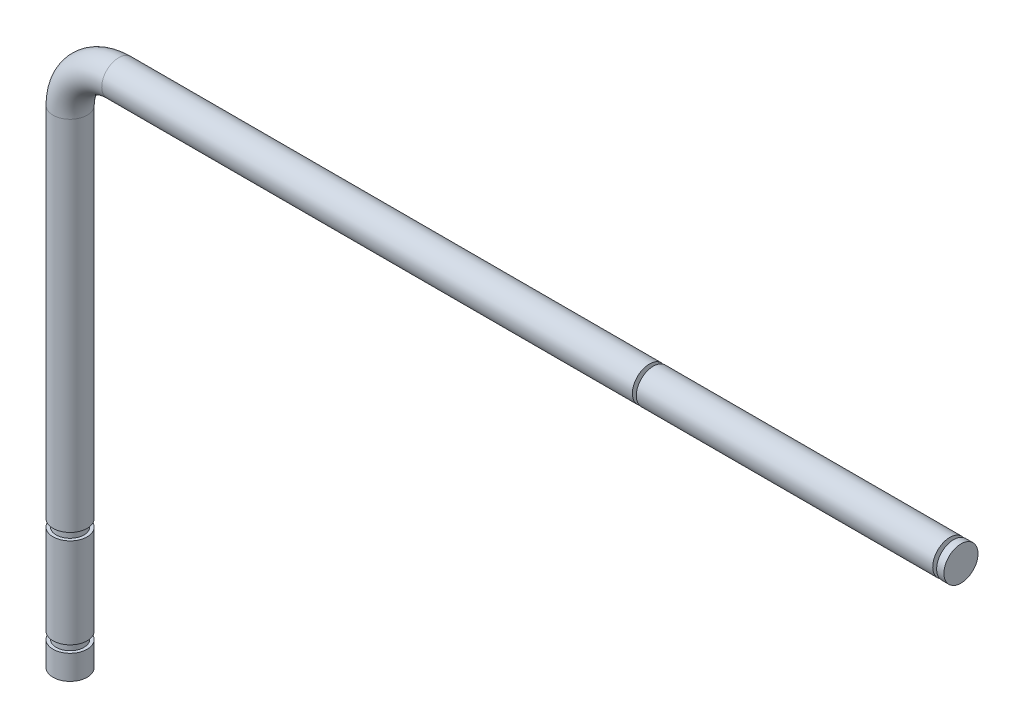
ISO-10303-21;
HEADER;
FILE_DESCRIPTION(('STEP AP214'),'2;1');
FILE_NAME('part.step','',(''),(''),'','','');
FILE_SCHEMA(('AUTOMOTIVE_DESIGN { 1 0 10303 214 1 1 1 1 }'));
ENDSEC;
DATA;
#1=APPLICATION_CONTEXT('core data for automotive mechanical design processes');
#2=APPLICATION_PROTOCOL_DEFINITION('international standard','automotive_design',2000,#1);
#3=PRODUCT_CONTEXT('',#1,'mechanical');
#4=PRODUCT('Part','Part','',(#3));
#5=PRODUCT_RELATED_PRODUCT_CATEGORY('part','',(#4));
#6=PRODUCT_DEFINITION_FORMATION('','',#4);
#7=PRODUCT_DEFINITION_CONTEXT('part definition',#1,'design');
#8=PRODUCT_DEFINITION('design','',#6,#7);
#9=PRODUCT_DEFINITION_SHAPE('','',#8);
#10=(LENGTH_UNIT() NAMED_UNIT(*) SI_UNIT(.MILLI.,.METRE.));
#11=(NAMED_UNIT(*) PLANE_ANGLE_UNIT() SI_UNIT($,.RADIAN.));
#12=(NAMED_UNIT(*) SI_UNIT($,.STERADIAN.) SOLID_ANGLE_UNIT());
#13=UNCERTAINTY_MEASURE_WITH_UNIT(LENGTH_MEASURE(1.E-05),#10,'distance_accuracy_value','');
#14=(GEOMETRIC_REPRESENTATION_CONTEXT(3) GLOBAL_UNCERTAINTY_ASSIGNED_CONTEXT((#13)) GLOBAL_UNIT_ASSIGNED_CONTEXT((#10,
#11,#12)) REPRESENTATION_CONTEXT('',''));
#15=CARTESIAN_POINT('',(0.,0.,0.));
#16=DIRECTION('',(0.,0.,1.));
#17=DIRECTION('',(1.,0.,0.));
#18=AXIS2_PLACEMENT_3D('',#15,#16,#17);
#19=CARTESIAN_POINT('',(183.,0.,0.));
#20=DIRECTION('',(-1.,0.,0.));
#21=DIRECTION('',(0.,0.,1.));
#22=AXIS2_PLACEMENT_3D('',#19,#20,#21);
#23=CYLINDRICAL_SURFACE('',#22,3.5);
#24=CARTESIAN_POINT('',(10.0000000000001,0.,0.));
#25=DIRECTION('',(1.,0.,0.));
#26=DIRECTION('',(0.,1.,0.));
#27=AXIS2_PLACEMENT_3D('',#24,#25,#26);
#28=CIRCLE('',#27,3.5);
#29=CARTESIAN_POINT('',(10.0000000000001,3.5,0.));
#30=VERTEX_POINT('',#29);
#31=EDGE_CURVE('E157',#30,#30,#28,.T.);
#32=ORIENTED_EDGE('',*,*,#31,.T.);
#33=EDGE_LOOP('',(#32));
#34=FACE_BOUND('',#33,.T.);
#35=CARTESIAN_POINT('',(119.,0.,0.));
#36=DIRECTION('',(1.,0.,0.));
#37=DIRECTION('',(0.,1.,0.));
#38=AXIS2_PLACEMENT_3D('',#35,#36,#37);
#39=CIRCLE('',#38,3.5);
#40=CARTESIAN_POINT('',(119.,3.5,0.));
#41=VERTEX_POINT('',#40);
#42=EDGE_CURVE('E127',#41,#41,#39,.T.);
#43=ORIENTED_EDGE('',*,*,#42,.F.);
#44=EDGE_LOOP('',(#43));
#45=FACE_BOUND('',#44,.T.);
#46=ADVANCED_FACE('F47',(#34,#45),#23,.T.);
#47=CARTESIAN_POINT('',(0.,-10.0000000000001,0.));
#48=DIRECTION('',(0.,-1.,0.));
#49=DIRECTION('',(1.,0.,0.));
#50=AXIS2_PLACEMENT_3D('',#47,#48,#49);
#51=CYLINDRICAL_SURFACE('',#50,3.5);
#52=CARTESIAN_POINT('',(0.,-85.,0.));
#53=DIRECTION('',(0.,-1.,0.));
#54=DIRECTION('',(1.,0.,0.));
#55=AXIS2_PLACEMENT_3D('',#52,#53,#54);
#56=CIRCLE('',#55,3.5);
#57=CARTESIAN_POINT('',(3.50000000000001,-85.,0.));
#58=VERTEX_POINT('',#57);
#59=EDGE_CURVE('E146',#58,#58,#56,.T.);
#60=CARTESIAN_POINT('',(0.,-103.5,0.));
#61=DIRECTION('',(0.,-1.,0.));
#62=DIRECTION('',(1.,0.,0.));
#63=AXIS2_PLACEMENT_3D('',#60,#61,#62);
#64=CIRCLE('',#63,3.5);
#65=CARTESIAN_POINT('',(3.50000000000001,-103.5,0.));
#66=VERTEX_POINT('',#65);
#67=EDGE_CURVE('E158',#66,#66,#64,.T.);
#68=CARTESIAN_POINT('',(3.50000000000001,-85.,0.));
#69=CARTESIAN_POINT('',(3.50000000000001,-85.1927083333333,0.));
#70=CARTESIAN_POINT('',(3.50000000000001,-85.3854166666666,0.));
#71=CARTESIAN_POINT('',(3.50000000000001,-85.7708333333333,0.));
#72=CARTESIAN_POINT('',(3.50000000000001,-85.9635416666666,0.));
#73=CARTESIAN_POINT('',(3.50000000000001,-86.3489583333333,0.));
#74=CARTESIAN_POINT('',(3.50000000000001,-86.5416666666666,0.));
#75=CARTESIAN_POINT('',(3.50000000000001,-86.9270833333333,0.));
#76=CARTESIAN_POINT('',(3.50000000000001,-87.1197916666666,0.));
#77=CARTESIAN_POINT('',(3.50000000000001,-87.5052083333333,0.));
#78=CARTESIAN_POINT('',(3.50000000000001,-87.6979166666666,0.));
#79=CARTESIAN_POINT('',(3.50000000000001,-88.0833333333333,0.));
#80=CARTESIAN_POINT('',(3.50000000000001,-88.2760416666666,0.));
#81=CARTESIAN_POINT('',(3.50000000000001,-88.6614583333333,0.));
#82=CARTESIAN_POINT('',(3.50000000000001,-88.8541666666666,0.));
#83=CARTESIAN_POINT('',(3.50000000000001,-89.2395833333333,0.));
#84=CARTESIAN_POINT('',(3.50000000000001,-89.4322916666666,0.));
#85=CARTESIAN_POINT('',(3.50000000000001,-89.8177083333333,0.));
#86=CARTESIAN_POINT('',(3.50000000000001,-90.0104166666666,0.));
#87=CARTESIAN_POINT('',(3.50000000000001,-90.3958333333333,0.));
#88=CARTESIAN_POINT('',(3.50000000000001,-90.5885416666666,0.));
#89=CARTESIAN_POINT('',(3.50000000000001,-90.9739583333333,0.));
#90=CARTESIAN_POINT('',(3.50000000000001,-91.1666666666666,0.));
#91=CARTESIAN_POINT('',(3.50000000000001,-91.5520833333333,0.));
#92=CARTESIAN_POINT('',(3.50000000000001,-91.7447916666666,0.));
#93=CARTESIAN_POINT('',(3.50000000000001,-92.1302083333333,0.));
#94=CARTESIAN_POINT('',(3.50000000000001,-92.3229166666666,0.));
#95=CARTESIAN_POINT('',(3.50000000000001,-92.7083333333333,0.));
#96=CARTESIAN_POINT('',(3.50000000000001,-92.9010416666666,0.));
#97=CARTESIAN_POINT('',(3.50000000000001,-93.2864583333333,0.));
#98=CARTESIAN_POINT('',(3.50000000000001,-93.4791666666666,0.));
#99=CARTESIAN_POINT('',(3.50000000000001,-93.8645833333333,0.));
#100=CARTESIAN_POINT('',(3.50000000000001,-94.0572916666666,0.));
#101=CARTESIAN_POINT('',(3.50000000000001,-94.4427083333333,0.));
#102=CARTESIAN_POINT('',(3.50000000000001,-94.6354166666666,0.));
#103=CARTESIAN_POINT('',(3.50000000000001,-95.0208333333333,0.));
#104=CARTESIAN_POINT('',(3.50000000000001,-95.2135416666666,0.));
#105=CARTESIAN_POINT('',(3.50000000000001,-95.5989583333333,0.));
#106=CARTESIAN_POINT('',(3.50000000000001,-95.7916666666666,0.));
#107=CARTESIAN_POINT('',(3.50000000000001,-96.1770833333333,0.));
#108=CARTESIAN_POINT('',(3.50000000000001,-96.3697916666666,0.));
#109=CARTESIAN_POINT('',(3.50000000000001,-96.7552083333333,0.));
#110=CARTESIAN_POINT('',(3.50000000000001,-96.9479166666666,0.));
#111=CARTESIAN_POINT('',(3.50000000000001,-97.3333333333333,0.));
#112=CARTESIAN_POINT('',(3.50000000000001,-97.5260416666666,0.));
#113=CARTESIAN_POINT('',(3.50000000000001,-97.9114583333333,0.));
#114=CARTESIAN_POINT('',(3.50000000000001,-98.1041666666666,0.));
#115=CARTESIAN_POINT('',(3.50000000000001,-98.4895833333333,0.));
#116=CARTESIAN_POINT('',(3.50000000000001,-98.6822916666666,0.));
#117=CARTESIAN_POINT('',(3.50000000000001,-99.0677083333333,0.));
#118=CARTESIAN_POINT('',(3.50000000000001,-99.2604166666666,0.));
#119=CARTESIAN_POINT('',(3.50000000000001,-99.6458333333333,0.));
#120=CARTESIAN_POINT('',(3.50000000000001,-99.8385416666666,0.));
#121=CARTESIAN_POINT('',(3.50000000000001,-100.223958333333,0.));
#122=CARTESIAN_POINT('',(3.50000000000001,-100.416666666667,0.));
#123=CARTESIAN_POINT('',(3.50000000000001,-100.802083333333,0.));
#124=CARTESIAN_POINT('',(3.50000000000001,-100.994791666667,0.));
#125=CARTESIAN_POINT('',(3.50000000000001,-101.380208333333,0.));
#126=CARTESIAN_POINT('',(3.50000000000001,-101.572916666667,0.));
#127=CARTESIAN_POINT('',(3.50000000000001,-101.958333333333,0.));
#128=CARTESIAN_POINT('',(3.50000000000001,-102.151041666667,0.));
#129=CARTESIAN_POINT('',(3.50000000000001,-102.536458333333,0.));
#130=CARTESIAN_POINT('',(3.50000000000001,-102.729166666667,0.));
#131=CARTESIAN_POINT('',(3.50000000000001,-103.114583333333,0.));
#132=CARTESIAN_POINT('',(3.50000000000001,-103.307291666667,0.));
#133=CARTESIAN_POINT('',(3.50000000000001,-103.5,0.));
#134=B_SPLINE_CURVE_WITH_KNOTS('',3,(#68,#69,#70,#71,#72,#73,#74,#75,#76,#77,#78,#79,#80,#81,
#82,#83,#84,#85,#86,#87,#88,#89,#90,#91,#92,#93,#94,#95,#96,#97,#98,#99,#100,#101,#102,#103,
#104,#105,#106,#107,#108,#109,#110,#111,#112,#113,#114,#115,#116,#117,#118,#119,#120,#121,#122,
#123,#124,#125,#126,#127,#128,#129,#130,#131,#132,#133),.UNSPECIFIED.,.F.,.F.,(4,2,2,2,2,2,2,2,
2,2,2,2,2,2,2,2,2,2,2,2,2,2,2,2,2,2,2,2,2,2,2,2,4),(0.,0.578124999999999,1.15625,1.734375,
2.3125,2.89062499999999,3.46874999999999,4.04687499999999,4.62499999999999,5.203125,5.78125,
6.359375,6.9375,7.515625,8.09375,8.671875,9.24999999999999,9.82812499999999,10.40625,10.984375,
11.5625,12.140625,12.71875,13.296875,13.875,14.453125,15.03125,15.609375,16.1875,16.765625,
17.34375,17.921875,18.5),.UNSPECIFIED.);
#135=EDGE_CURVE('BSEAM78',#58,#66,#134,.T.);
#136=ORIENTED_EDGE('',*,*,#59,.T.);
#137=ORIENTED_EDGE('',*,*,#67,.F.);
#138=ORIENTED_EDGE('',*,*,#135,.T.);
#139=ORIENTED_EDGE('',*,*,#135,.F.);
#140=EDGE_LOOP('',(#136,#138,#137,#139));
#141=FACE_BOUND('',#140,.T.);
#142=ADVANCED_FACE('F78',(#141),#51,.T.);
#143=CARTESIAN_POINT('',(0.,-103.5,0.));
#144=DIRECTION('',(0.,-1.,0.));
#145=DIRECTION('',(1.,0.,0.));
#146=AXIS2_PLACEMENT_3D('',#143,#144,#145);
#147=PLANE('',#146);
#148=CARTESIAN_POINT('',(0.,-103.5,0.));
#149=DIRECTION('',(0.,-1.,0.));
#150=DIRECTION('',(1.,0.,0.));
#151=AXIS2_PLACEMENT_3D('',#148,#149,#150);
#152=CIRCLE('',#151,2.85);
#153=CARTESIAN_POINT('',(2.85000000000001,-103.5,0.));
#154=VERTEX_POINT('',#153);
#155=EDGE_CURVE('E149',#154,#154,#152,.T.);
#156=ORIENTED_EDGE('',*,*,#155,.F.);
#157=EDGE_LOOP('',(#156));
#158=FACE_BOUND('',#157,.T.);
#159=ORIENTED_EDGE('',*,*,#67,.T.);
#160=EDGE_LOOP('',(#159));
#161=FACE_BOUND('',#160,.T.);
#162=ADVANCED_FACE('F90',(#158,#161),#147,.T.);
#163=CARTESIAN_POINT('',(0.,-105.,0.));
#164=DIRECTION('',(0.,-1.,0.));
#165=DIRECTION('',(1.,0.,0.));
#166=AXIS2_PLACEMENT_3D('',#163,#164,#165);
#167=PLANE('',#166);
#168=CARTESIAN_POINT('',(0.,-105.,0.));
#169=DIRECTION('',(0.,-1.,0.));
#170=DIRECTION('',(1.,0.,0.));
#171=AXIS2_PLACEMENT_3D('',#168,#169,#170);
#172=CIRCLE('',#171,2.85);
#173=CARTESIAN_POINT('',(2.85000000000001,-105.,0.));
#174=VERTEX_POINT('',#173);
#175=EDGE_CURVE('E153',#174,#174,#172,.T.);
#176=ORIENTED_EDGE('',*,*,#175,.T.);
#177=EDGE_LOOP('',(#176));
#178=FACE_BOUND('',#177,.T.);
#179=CARTESIAN_POINT('',(0.,-105.,0.));
#180=DIRECTION('',(0.,-1.,0.));
#181=DIRECTION('',(1.,0.,0.));
#182=AXIS2_PLACEMENT_3D('',#179,#180,#181);
#183=CIRCLE('',#182,3.5);
#184=CARTESIAN_POINT('',(3.50000000000001,-105.,0.));
#185=VERTEX_POINT('',#184);
#186=EDGE_CURVE('E152',#185,#185,#183,.T.);
#187=ORIENTED_EDGE('',*,*,#186,.F.);
#188=EDGE_LOOP('',(#187));
#189=FACE_BOUND('',#188,.T.);
#190=ADVANCED_FACE('F79',(#178,#189),#167,.F.);
#191=CARTESIAN_POINT('',(0.,-103.5,0.));
#192=DIRECTION('',(0.,-1.,0.));
#193=DIRECTION('',(1.,0.,0.));
#194=AXIS2_PLACEMENT_3D('',#191,#192,#193);
#195=CYLINDRICAL_SURFACE('',#194,2.85);
#196=ORIENTED_EDGE('',*,*,#155,.T.);
#197=EDGE_LOOP('',(#196));
#198=FACE_BOUND('',#197,.T.);
#199=ORIENTED_EDGE('',*,*,#175,.F.);
#200=EDGE_LOOP('',(#199));
#201=FACE_BOUND('',#200,.T.);
#202=ADVANCED_FACE('F69',(#198,#201),#195,.T.);
#203=CARTESIAN_POINT('',(0.,-110.,0.));
#204=DIRECTION('',(0.,1.,0.));
#205=DIRECTION('',(-1.,0.,0.));
#206=AXIS2_PLACEMENT_3D('',#203,#204,#205);
#207=PLANE('',#206);
#208=CARTESIAN_POINT('',(0.,-110.,0.));
#209=DIRECTION('',(0.,1.,0.));
#210=DIRECTION('',(-1.,0.,0.));
#211=AXIS2_PLACEMENT_3D('',#208,#209,#210);
#212=CIRCLE('',#211,3.5);
#213=CARTESIAN_POINT('',(-3.49999999999999,-110.,0.));
#214=VERTEX_POINT('',#213);
#215=EDGE_CURVE('E12',#214,#214,#212,.T.);
#216=ORIENTED_EDGE('',*,*,#215,.F.);
#217=EDGE_LOOP('',(#216));
#218=FACE_BOUND('',#217,.T.);
#219=ADVANCED_FACE('F67',(#218),#207,.F.);
#220=ORIENTED_EDGE('',*,*,#186,.T.);
#221=EDGE_LOOP('',(#220));
#222=FACE_BOUND('',#221,.T.);
#223=ORIENTED_EDGE('',*,*,#215,.T.);
#224=EDGE_LOOP('',(#223));
#225=FACE_BOUND('',#224,.T.);
#226=ADVANCED_FACE('F65',(#222,#225),#51,.T.);
#227=CARTESIAN_POINT('',(0.,-83.5,0.));
#228=DIRECTION('',(0.,-1.,0.));
#229=DIRECTION('',(1.,0.,0.));
#230=AXIS2_PLACEMENT_3D('',#227,#228,#229);
#231=PLANE('',#230);
#232=CARTESIAN_POINT('',(0.,-83.5,0.));
#233=DIRECTION('',(0.,-1.,0.));
#234=DIRECTION('',(1.,0.,0.));
#235=AXIS2_PLACEMENT_3D('',#232,#233,#234);
#236=CIRCLE('',#235,2.85);
#237=CARTESIAN_POINT('',(2.85000000000001,-83.5,0.));
#238=VERTEX_POINT('',#237);
#239=EDGE_CURVE('E143',#238,#238,#236,.T.);
#240=ORIENTED_EDGE('',*,*,#239,.F.);
#241=EDGE_LOOP('',(#240));
#242=FACE_BOUND('',#241,.T.);
#243=CARTESIAN_POINT('',(0.,-83.5,0.));
#244=DIRECTION('',(0.,-1.,0.));
#245=DIRECTION('',(1.,0.,0.));
#246=AXIS2_PLACEMENT_3D('',#243,#244,#245);
#247=CIRCLE('',#246,3.5);
#248=CARTESIAN_POINT('',(3.50000000000001,-83.5,0.));
#249=VERTEX_POINT('',#248);
#250=EDGE_CURVE('E125',#249,#249,#247,.T.);
#251=ORIENTED_EDGE('',*,*,#250,.T.);
#252=EDGE_LOOP('',(#251));
#253=FACE_BOUND('',#252,.T.);
#254=ADVANCED_FACE('F74',(#242,#253),#231,.T.);
#255=CARTESIAN_POINT('',(0.,-85.,0.));
#256=DIRECTION('',(0.,-1.,0.));
#257=DIRECTION('',(1.,0.,0.));
#258=AXIS2_PLACEMENT_3D('',#255,#256,#257);
#259=PLANE('',#258);
#260=CARTESIAN_POINT('',(0.,-85.,0.));
#261=DIRECTION('',(0.,-1.,0.));
#262=DIRECTION('',(1.,0.,0.));
#263=AXIS2_PLACEMENT_3D('',#260,#261,#262);
#264=CIRCLE('',#263,2.85);
#265=CARTESIAN_POINT('',(2.85000000000001,-85.,0.));
#266=VERTEX_POINT('',#265);
#267=EDGE_CURVE('E119',#266,#266,#264,.T.);
#268=ORIENTED_EDGE('',*,*,#267,.T.);
#269=EDGE_LOOP('',(#268));
#270=FACE_BOUND('',#269,.T.);
#271=ORIENTED_EDGE('',*,*,#59,.F.);
#272=EDGE_LOOP('',(#271));
#273=FACE_BOUND('',#272,.T.);
#274=ADVANCED_FACE('F189',(#270,#273),#259,.F.);
#275=CARTESIAN_POINT('',(0.,-83.5,0.));
#276=DIRECTION('',(0.,-1.,0.));
#277=DIRECTION('',(1.,0.,0.));
#278=AXIS2_PLACEMENT_3D('',#275,#276,#277);
#279=CYLINDRICAL_SURFACE('',#278,2.85);
#280=ORIENTED_EDGE('',*,*,#239,.T.);
#281=EDGE_LOOP('',(#280));
#282=FACE_BOUND('',#281,.T.);
#283=ORIENTED_EDGE('',*,*,#267,.F.);
#284=EDGE_LOOP('',(#283));
#285=FACE_BOUND('',#284,.T.);
#286=ADVANCED_FACE('F181',(#282,#285),#279,.T.);
#287=CARTESIAN_POINT('',(10.,-10.,0.));
#288=DIRECTION('',(0.,0.,1.));
#289=DIRECTION('',(1.,0.,0.));
#290=AXIS2_PLACEMENT_3D('',#287,#288,#289);
#291=TOROIDAL_SURFACE('',#290,10.,3.5);
#292=CARTESIAN_POINT('',(-7.1125568617077E-13,-10.0000000000001,0.));
#293=DIRECTION('',(0.,1.,0.));
#294=DIRECTION('',(-1.,0.,0.));
#295=AXIS2_PLACEMENT_3D('',#292,#293,#294);
#296=CIRCLE('',#295,3.5);
#297=CARTESIAN_POINT('',(-3.5,-10.0000000000001,0.));
#298=VERTEX_POINT('',#297);
#299=EDGE_CURVE('E56',#298,#298,#296,.T.);
#300=CARTESIAN_POINT('',(10.,-10.,0.));
#301=DIRECTION('',(0.,0.,1.));
#302=DIRECTION('',(1.,0.,0.));
#303=AXIS2_PLACEMENT_3D('',#300,#301,#302);
#304=CIRCLE('',#303,13.5);
#305=EDGE_CURVE('',#30,#298,#304,.T.);
#306=ORIENTED_EDGE('',*,*,#31,.F.);
#307=ORIENTED_EDGE('',*,*,#299,.T.);
#308=ORIENTED_EDGE('',*,*,#305,.T.);
#309=ORIENTED_EDGE('',*,*,#305,.F.);
#310=EDGE_LOOP('',(#306,#308,#307,#309));
#311=FACE_BOUND('',#310,.T.);
#312=ADVANCED_FACE('F173',(#311),#291,.T.);
#313=ORIENTED_EDGE('',*,*,#299,.F.);
#314=EDGE_LOOP('',(#313));
#315=FACE_BOUND('',#314,.T.);
#316=ORIENTED_EDGE('',*,*,#250,.F.);
#317=EDGE_LOOP('',(#316));
#318=FACE_BOUND('',#317,.T.);
#319=ADVANCED_FACE('F77',(#315,#318),#51,.T.);
#320=CARTESIAN_POINT('',(119.8,1.97910264565504E-12,-7.49400541621981E-13));
#321=DIRECTION('',(1.,0.,0.));
#322=DIRECTION('',(0.,1.,0.));
#323=AXIS2_PLACEMENT_3D('',#320,#321,#322);
#324=PLANE('',#323);
#325=CARTESIAN_POINT('',(119.8,1.97910264565504E-12,-7.49400541621981E-13));
#326=DIRECTION('',(1.,0.,0.));
#327=DIRECTION('',(0.,1.,0.));
#328=AXIS2_PLACEMENT_3D('',#325,#326,#327);
#329=CIRCLE('',#328,1.59999999999883);
#330=CARTESIAN_POINT('',(119.8,1.60000000000081,-7.49400541621981E-13));
#331=VERTEX_POINT('',#330);
#332=EDGE_CURVE('E129',#331,#331,#329,.T.);
#333=ORIENTED_EDGE('',*,*,#332,.T.);
#334=EDGE_LOOP('',(#333));
#335=FACE_BOUND('',#334,.T.);
#336=CARTESIAN_POINT('',(119.8,0.,0.));
#337=DIRECTION('',(1.,0.,0.));
#338=DIRECTION('',(0.,1.,0.));
#339=AXIS2_PLACEMENT_3D('',#336,#337,#338);
#340=CIRCLE('',#339,3.5);
#341=CARTESIAN_POINT('',(119.8,3.5,0.));
#342=VERTEX_POINT('',#341);
#343=EDGE_CURVE('E51',#342,#342,#340,.T.);
#344=ORIENTED_EDGE('',*,*,#343,.F.);
#345=EDGE_LOOP('',(#344));
#346=FACE_BOUND('',#345,.T.);
#347=ADVANCED_FACE('F172',(#335,#346),#324,.F.);
#348=CARTESIAN_POINT('',(119.,1.97910264565504E-12,-7.49400541621981E-13));
#349=DIRECTION('',(1.,0.,0.));
#350=DIRECTION('',(0.,1.,0.));
#351=AXIS2_PLACEMENT_3D('',#348,#349,#350);
#352=PLANE('',#351);
#353=CARTESIAN_POINT('',(119.,1.97910264565504E-12,-7.49400541621981E-13));
#354=DIRECTION('',(1.,0.,0.));
#355=DIRECTION('',(0.,1.,0.));
#356=AXIS2_PLACEMENT_3D('',#353,#354,#355);
#357=CIRCLE('',#356,1.59999999999883);
#358=CARTESIAN_POINT('',(119.,1.60000000000081,-7.49400541621981E-13));
#359=VERTEX_POINT('',#358);
#360=EDGE_CURVE('E134',#359,#359,#357,.T.);
#361=ORIENTED_EDGE('',*,*,#360,.F.);
#362=EDGE_LOOP('',(#361));
#363=FACE_BOUND('',#362,.T.);
#364=ORIENTED_EDGE('',*,*,#42,.T.);
#365=EDGE_LOOP('',(#364));
#366=FACE_BOUND('',#365,.T.);
#367=ADVANCED_FACE('F179',(#363,#366),#352,.T.);
#368=CARTESIAN_POINT('',(119.8,1.97910264565504E-12,-7.49400541621981E-13));
#369=DIRECTION('',(-1.,0.,0.));
#370=DIRECTION('',(0.,-1.,0.));
#371=AXIS2_PLACEMENT_3D('',#368,#369,#370);
#372=CYLINDRICAL_SURFACE('',#371,1.59999999999883);
#373=ORIENTED_EDGE('',*,*,#332,.F.);
#374=EDGE_LOOP('',(#373));
#375=FACE_BOUND('',#374,.T.);
#376=ORIENTED_EDGE('',*,*,#360,.T.);
#377=EDGE_LOOP('',(#376));
#378=FACE_BOUND('',#377,.T.);
#379=ADVANCED_FACE('F109',(#375,#378),#372,.T.);
#380=CARTESIAN_POINT('',(183.,0.,0.));
#381=DIRECTION('',(1.,0.,0.));
#382=DIRECTION('',(0.,1.,0.));
#383=AXIS2_PLACEMENT_3D('',#380,#381,#382);
#384=PLANE('',#383);
#385=CARTESIAN_POINT('',(183.,0.,0.));
#386=DIRECTION('',(1.,0.,0.));
#387=DIRECTION('',(0.,1.,0.));
#388=AXIS2_PLACEMENT_3D('',#385,#386,#387);
#389=CIRCLE('',#388,3.5);
#390=CARTESIAN_POINT('',(183.,3.5,0.));
#391=VERTEX_POINT('',#390);
#392=EDGE_CURVE('E62',#391,#391,#389,.T.);
#393=ORIENTED_EDGE('',*,*,#392,.T.);
#394=EDGE_LOOP('',(#393));
#395=FACE_BOUND('',#394,.T.);
#396=ADVANCED_FACE('F49',(#395),#384,.T.);
#397=CARTESIAN_POINT('',(181.5,0.,0.));
#398=DIRECTION('',(1.,0.,0.));
#399=DIRECTION('',(0.,1.,0.));
#400=AXIS2_PLACEMENT_3D('',#397,#398,#399);
#401=CIRCLE('',#400,3.5);
#402=CARTESIAN_POINT('',(181.5,3.5,0.));
#403=VERTEX_POINT('',#402);
#404=EDGE_CURVE('E113',#403,#403,#401,.T.);
#405=ORIENTED_EDGE('',*,*,#404,.T.);
#406=EDGE_LOOP('',(#405));
#407=FACE_BOUND('',#406,.T.);
#408=ORIENTED_EDGE('',*,*,#392,.F.);
#409=EDGE_LOOP('',(#408));
#410=FACE_BOUND('',#409,.T.);
#411=ADVANCED_FACE('F86',(#407,#410),#23,.T.);
#412=CARTESIAN_POINT('',(181.5,0.,0.));
#413=DIRECTION('',(1.,0.,0.));
#414=DIRECTION('',(0.,1.,0.));
#415=AXIS2_PLACEMENT_3D('',#412,#413,#414);
#416=PLANE('',#415);
#417=CARTESIAN_POINT('',(181.5,0.,0.));
#418=DIRECTION('',(1.,0.,0.));
#419=DIRECTION('',(0.,1.,0.));
#420=AXIS2_PLACEMENT_3D('',#417,#418,#419);
#421=CIRCLE('',#420,1.6);
#422=CARTESIAN_POINT('',(181.5,1.6,0.));
#423=VERTEX_POINT('',#422);
#424=EDGE_CURVE('E122',#423,#423,#421,.T.);
#425=ORIENTED_EDGE('',*,*,#424,.T.);
#426=EDGE_LOOP('',(#425));
#427=FACE_BOUND('',#426,.T.);
#428=ORIENTED_EDGE('',*,*,#404,.F.);
#429=EDGE_LOOP('',(#428));
#430=FACE_BOUND('',#429,.T.);
#431=ADVANCED_FACE('F100',(#427,#430),#416,.F.);
#432=CARTESIAN_POINT('',(180.7,0.,0.));
#433=DIRECTION('',(1.,0.,0.));
#434=DIRECTION('',(0.,1.,0.));
#435=AXIS2_PLACEMENT_3D('',#432,#433,#434);
#436=CYLINDRICAL_SURFACE('',#435,1.6);
#437=CARTESIAN_POINT('',(180.7,0.,0.));
#438=DIRECTION('',(1.,0.,0.));
#439=DIRECTION('',(0.,1.,0.));
#440=AXIS2_PLACEMENT_3D('',#437,#438,#439);
#441=CIRCLE('',#440,1.6);
#442=CARTESIAN_POINT('',(180.7,1.6,0.));
#443=VERTEX_POINT('',#442);
#444=EDGE_CURVE('E116',#443,#443,#441,.T.);
#445=ORIENTED_EDGE('',*,*,#444,.T.);
#446=EDGE_LOOP('',(#445));
#447=FACE_BOUND('',#446,.T.);
#448=ORIENTED_EDGE('',*,*,#424,.F.);
#449=EDGE_LOOP('',(#448));
#450=FACE_BOUND('',#449,.T.);
#451=ADVANCED_FACE('F106',(#447,#450),#436,.T.);
#452=CARTESIAN_POINT('',(180.7,0.,0.));
#453=DIRECTION('',(1.,0.,0.));
#454=DIRECTION('',(0.,1.,0.));
#455=AXIS2_PLACEMENT_3D('',#452,#453,#454);
#456=PLANE('',#455);
#457=ORIENTED_EDGE('',*,*,#444,.F.);
#458=EDGE_LOOP('',(#457));
#459=FACE_BOUND('',#458,.T.);
#460=CARTESIAN_POINT('',(180.7,0.,0.));
#461=DIRECTION('',(1.,0.,0.));
#462=DIRECTION('',(0.,1.,0.));
#463=AXIS2_PLACEMENT_3D('',#460,#461,#462);
#464=CIRCLE('',#463,3.5);
#465=CARTESIAN_POINT('',(180.7,3.5,0.));
#466=VERTEX_POINT('',#465);
#467=EDGE_CURVE('E115',#466,#466,#464,.T.);
#468=ORIENTED_EDGE('',*,*,#467,.T.);
#469=EDGE_LOOP('',(#468));
#470=FACE_BOUND('',#469,.T.);
#471=ADVANCED_FACE('F97',(#459,#470),#456,.T.);
#472=ORIENTED_EDGE('',*,*,#343,.T.);
#473=EDGE_LOOP('',(#472));
#474=FACE_BOUND('',#473,.T.);
#475=ORIENTED_EDGE('',*,*,#467,.F.);
#476=EDGE_LOOP('',(#475));
#477=FACE_BOUND('',#476,.T.);
#478=ADVANCED_FACE('F85',(#474,#477),#23,.T.);
#479=CLOSED_SHELL('',(#46,#142,#162,#190,#202,#219,#226,#254,#274,#286,#312,#319,#347,#367,#379,
#396,#411,#431,#451,#471,#478));
#480=MANIFOLD_SOLID_BREP('B2',#479);
#481=ADVANCED_BREP_SHAPE_REPRESENTATION('',(#18,#480),#14);
#482=SHAPE_DEFINITION_REPRESENTATION(#9,#481);
ENDSEC;
END-ISO-10303-21;
